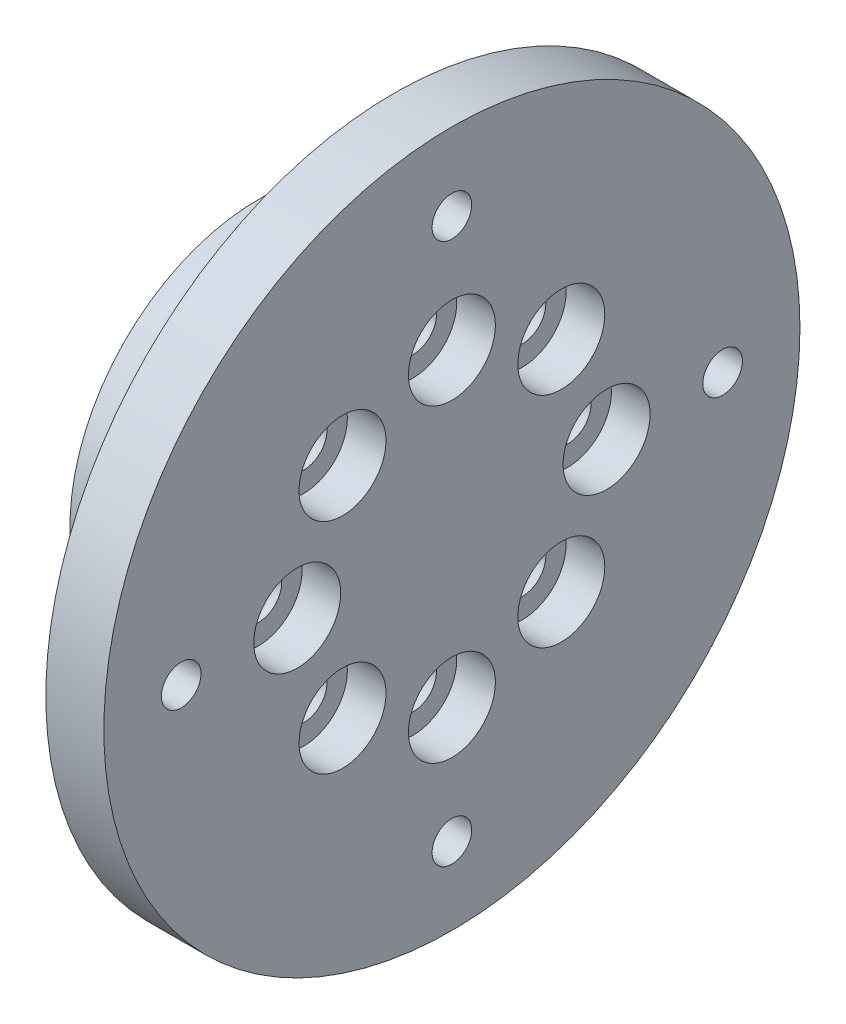
ISO-10303-21;
HEADER;
FILE_DESCRIPTION(('STEP AP214'),'2;1');
FILE_NAME('part.step','',(''),(''),'','','');
FILE_SCHEMA(('AUTOMOTIVE_DESIGN { 1 0 10303 214 1 1 1 1 }'));
ENDSEC;
DATA;
#1=APPLICATION_CONTEXT('core data for automotive mechanical design processes');
#2=APPLICATION_PROTOCOL_DEFINITION('international standard','automotive_design',2000,#1);
#3=PRODUCT_CONTEXT('',#1,'mechanical');
#4=PRODUCT('Part','Part','',(#3));
#5=PRODUCT_RELATED_PRODUCT_CATEGORY('part','',(#4));
#6=PRODUCT_DEFINITION_FORMATION('','',#4);
#7=PRODUCT_DEFINITION_CONTEXT('part definition',#1,'design');
#8=PRODUCT_DEFINITION('design','',#6,#7);
#9=PRODUCT_DEFINITION_SHAPE('','',#8);
#10=(LENGTH_UNIT() NAMED_UNIT(*) SI_UNIT(.MILLI.,.METRE.));
#11=(NAMED_UNIT(*) PLANE_ANGLE_UNIT() SI_UNIT($,.RADIAN.));
#12=(NAMED_UNIT(*) SI_UNIT($,.STERADIAN.) SOLID_ANGLE_UNIT());
#13=UNCERTAINTY_MEASURE_WITH_UNIT(LENGTH_MEASURE(1.E-05),#10,'distance_accuracy_value','');
#14=(GEOMETRIC_REPRESENTATION_CONTEXT(3) GLOBAL_UNCERTAINTY_ASSIGNED_CONTEXT((#13)) GLOBAL_UNIT_ASSIGNED_CONTEXT((#10,
#11,#12)) REPRESENTATION_CONTEXT('',''));
#15=CARTESIAN_POINT('',(0.,0.,0.));
#16=DIRECTION('',(0.,0.,1.));
#17=DIRECTION('',(1.,0.,0.));
#18=AXIS2_PLACEMENT_3D('',#15,#16,#17);
#19=CARTESIAN_POINT('',(10.,0.,0.));
#20=DIRECTION('',(-1.,0.,0.));
#21=DIRECTION('',(0.,0.,1.));
#22=AXIS2_PLACEMENT_3D('',#19,#20,#21);
#23=CYLINDRICAL_SURFACE('',#22,9.75);
#24=CARTESIAN_POINT('',(0.,0.,0.));
#25=DIRECTION('',(1.,0.,0.));
#26=DIRECTION('',(0.,0.,-1.));
#27=AXIS2_PLACEMENT_3D('',#24,#25,#26);
#28=CIRCLE('',#27,9.75);
#29=CARTESIAN_POINT('',(0.,0.,-9.75));
#30=VERTEX_POINT('',#29);
#31=EDGE_CURVE('E48',#30,#30,#28,.T.);
#32=ORIENTED_EDGE('',*,*,#31,.T.);
#33=EDGE_LOOP('',(#32));
#34=FACE_BOUND('',#33,.T.);
#35=CARTESIAN_POINT('',(7.,0.,0.));
#36=DIRECTION('',(1.,0.,0.));
#37=DIRECTION('',(0.,0.,-1.));
#38=AXIS2_PLACEMENT_3D('',#35,#36,#37);
#39=CIRCLE('',#38,9.75);
#40=CARTESIAN_POINT('',(7.,0.,-9.75));
#41=VERTEX_POINT('',#40);
#42=EDGE_CURVE('E10',#41,#41,#39,.T.);
#43=ORIENTED_EDGE('',*,*,#42,.F.);
#44=EDGE_LOOP('',(#43));
#45=FACE_BOUND('',#44,.T.);
#46=ADVANCED_FACE('F41',(#34,#45),#23,.T.);
#47=CARTESIAN_POINT('',(0.,0.,0.));
#48=DIRECTION('',(1.,0.,0.));
#49=DIRECTION('',(0.,0.,-1.));
#50=AXIS2_PLACEMENT_3D('',#47,#48,#49);
#51=PLANE('',#50);
#52=CARTESIAN_POINT('',(0.,0.,0.));
#53=DIRECTION('',(-1.,0.,0.));
#54=DIRECTION('',(0.,0.,1.));
#55=AXIS2_PLACEMENT_3D('',#52,#53,#54);
#56=CIRCLE('',#55,4.);
#57=CARTESIAN_POINT('',(0.,0.,4.));
#58=VERTEX_POINT('',#57);
#59=EDGE_CURVE('E193',#58,#58,#56,.T.);
#60=ORIENTED_EDGE('',*,*,#59,.F.);
#61=EDGE_LOOP('',(#60));
#62=FACE_BOUND('',#61,.T.);
#63=CARTESIAN_POINT('',(0.,8.,0.));
#64=DIRECTION('',(1.,0.,0.));
#65=DIRECTION('',(0.,0.,-1.));
#66=AXIS2_PLACEMENT_3D('',#63,#64,#65);
#67=CIRCLE('',#66,1.2);
#68=CARTESIAN_POINT('',(0.,8.,-1.2));
#69=VERTEX_POINT('',#68);
#70=EDGE_CURVE('E176',#69,#69,#67,.T.);
#71=ORIENTED_EDGE('',*,*,#70,.T.);
#72=EDGE_LOOP('',(#71));
#73=FACE_BOUND('',#72,.T.);
#74=CARTESIAN_POINT('',(0.,5.65685424949262,-5.65685424949248));
#75=DIRECTION('',(1.,0.,0.));
#76=DIRECTION('',(0.,0.,-1.));
#77=AXIS2_PLACEMENT_3D('',#74,#75,#76);
#78=CIRCLE('',#77,1.2);
#79=CARTESIAN_POINT('',(0.,5.65685424949262,-6.85685424949248));
#80=VERTEX_POINT('',#79);
#81=EDGE_CURVE('E160',#80,#80,#78,.T.);
#82=ORIENTED_EDGE('',*,*,#81,.T.);
#83=EDGE_LOOP('',(#82));
#84=FACE_BOUND('',#83,.T.);
#85=CARTESIAN_POINT('',(0.,3.4008079572553E-13,-8.00000000000034));
#86=DIRECTION('',(1.,0.,0.));
#87=DIRECTION('',(0.,0.,-1.));
#88=AXIS2_PLACEMENT_3D('',#85,#86,#87);
#89=CIRCLE('',#88,1.2);
#90=CARTESIAN_POINT('',(0.,3.4008079572553E-13,-9.20000000000034));
#91=VERTEX_POINT('',#90);
#92=EDGE_CURVE('E144',#91,#91,#89,.T.);
#93=ORIENTED_EDGE('',*,*,#92,.T.);
#94=EDGE_LOOP('',(#93));
#95=FACE_BOUND('',#94,.T.);
#96=CARTESIAN_POINT('',(0.,-5.65685424949214,-5.65685424949296));
#97=DIRECTION('',(1.,0.,0.));
#98=DIRECTION('',(0.,0.,-1.));
#99=AXIS2_PLACEMENT_3D('',#96,#97,#98);
#100=CIRCLE('',#99,1.2);
#101=CARTESIAN_POINT('',(0.,-5.65685424949214,-6.85685424949296));
#102=VERTEX_POINT('',#101);
#103=EDGE_CURVE('E128',#102,#102,#100,.T.);
#104=ORIENTED_EDGE('',*,*,#103,.T.);
#105=EDGE_LOOP('',(#104));
#106=FACE_BOUND('',#105,.T.);
#107=CARTESIAN_POINT('',(0.,-8.,-6.8016159145106E-13));
#108=DIRECTION('',(1.,0.,0.));
#109=DIRECTION('',(0.,0.,-1.));
#110=AXIS2_PLACEMENT_3D('',#107,#108,#109);
#111=CIRCLE('',#110,1.2);
#112=CARTESIAN_POINT('',(0.,-8.,-1.20000000000068));
#113=VERTEX_POINT('',#112);
#114=EDGE_CURVE('E112',#113,#113,#111,.T.);
#115=ORIENTED_EDGE('',*,*,#114,.T.);
#116=EDGE_LOOP('',(#115));
#117=FACE_BOUND('',#116,.T.);
#118=CARTESIAN_POINT('',(0.,-5.65685424949262,5.6568542494918));
#119=DIRECTION('',(1.,0.,0.));
#120=DIRECTION('',(0.,0.,-1.));
#121=AXIS2_PLACEMENT_3D('',#118,#119,#120);
#122=CIRCLE('',#121,1.2);
#123=CARTESIAN_POINT('',(0.,-5.65685424949262,4.4568542494918));
#124=VERTEX_POINT('',#123);
#125=EDGE_CURVE('E96',#124,#124,#122,.T.);
#126=ORIENTED_EDGE('',*,*,#125,.T.);
#127=EDGE_LOOP('',(#126));
#128=FACE_BOUND('',#127,.T.);
#129=CARTESIAN_POINT('',(0.,-3.41060513164848E-13,7.99999999999966));
#130=DIRECTION('',(1.,0.,0.));
#131=DIRECTION('',(0.,0.,-1.));
#132=AXIS2_PLACEMENT_3D('',#129,#130,#131);
#133=CIRCLE('',#132,1.2);
#134=CARTESIAN_POINT('',(0.,-3.41060513164848E-13,6.79999999999966));
#135=VERTEX_POINT('',#134);
#136=EDGE_CURVE('E80',#135,#135,#133,.T.);
#137=ORIENTED_EDGE('',*,*,#136,.T.);
#138=EDGE_LOOP('',(#137));
#139=FACE_BOUND('',#138,.T.);
#140=CARTESIAN_POINT('',(0.,5.65685424949214,5.65685424949228));
#141=DIRECTION('',(1.,0.,0.));
#142=DIRECTION('',(0.,0.,-1.));
#143=AXIS2_PLACEMENT_3D('',#140,#141,#142);
#144=CIRCLE('',#143,1.2);
#145=CARTESIAN_POINT('',(0.,5.65685424949214,4.45685424949228));
#146=VERTEX_POINT('',#145);
#147=EDGE_CURVE('E63',#146,#146,#144,.T.);
#148=ORIENTED_EDGE('',*,*,#147,.T.);
#149=EDGE_LOOP('',(#148));
#150=FACE_BOUND('',#149,.T.);
#151=ORIENTED_EDGE('',*,*,#31,.F.);
#152=EDGE_LOOP('',(#151));
#153=FACE_BOUND('',#152,.T.);
#154=ADVANCED_FACE('F253',(#62,#73,#84,#95,#106,#117,#128,#139,#150,#153),#51,.F.);
#155=CARTESIAN_POINT('',(10.,0.,0.));
#156=DIRECTION('',(-1.,0.,0.));
#157=DIRECTION('',(0.,0.,1.));
#158=AXIS2_PLACEMENT_3D('',#155,#156,#157);
#159=CYLINDRICAL_SURFACE('',#158,18.);
#160=CARTESIAN_POINT('',(10.,0.,0.));
#161=DIRECTION('',(1.,0.,0.));
#162=DIRECTION('',(0.,0.,-1.));
#163=AXIS2_PLACEMENT_3D('',#160,#161,#162);
#164=CIRCLE('',#163,18.);
#165=CARTESIAN_POINT('',(10.,0.,-18.));
#166=VERTEX_POINT('',#165);
#167=EDGE_CURVE('E53',#166,#166,#164,.T.);
#168=ORIENTED_EDGE('',*,*,#167,.F.);
#169=EDGE_LOOP('',(#168));
#170=FACE_BOUND('',#169,.T.);
#171=CARTESIAN_POINT('',(7.,0.,0.));
#172=DIRECTION('',(1.,0.,0.));
#173=DIRECTION('',(0.,0.,-1.));
#174=AXIS2_PLACEMENT_3D('',#171,#172,#173);
#175=CIRCLE('',#174,18.);
#176=CARTESIAN_POINT('',(7.,0.,-18.));
#177=VERTEX_POINT('',#176);
#178=EDGE_CURVE('E58',#177,#177,#175,.T.);
#179=ORIENTED_EDGE('',*,*,#178,.T.);
#180=EDGE_LOOP('',(#179));
#181=FACE_BOUND('',#180,.T.);
#182=ADVANCED_FACE('F257',(#170,#181),#159,.T.);
#183=CARTESIAN_POINT('',(7.,0.,0.));
#184=DIRECTION('',(1.,0.,0.));
#185=DIRECTION('',(0.,0.,-1.));
#186=AXIS2_PLACEMENT_3D('',#183,#184,#185);
#187=PLANE('',#186);
#188=CARTESIAN_POINT('',(7.,14.,0.));
#189=DIRECTION('',(1.,0.,0.));
#190=DIRECTION('',(0.,0.,-1.));
#191=AXIS2_PLACEMENT_3D('',#188,#189,#190);
#192=CIRCLE('',#191,1.025);
#193=CARTESIAN_POINT('',(7.,14.,-1.025));
#194=VERTEX_POINT('',#193);
#195=EDGE_CURVE('E224',#194,#194,#192,.T.);
#196=ORIENTED_EDGE('',*,*,#195,.T.);
#197=EDGE_LOOP('',(#196));
#198=FACE_BOUND('',#197,.T.);
#199=CARTESIAN_POINT('',(7.,0.,-14.));
#200=DIRECTION('',(1.,0.,0.));
#201=DIRECTION('',(0.,0.,-1.));
#202=AXIS2_PLACEMENT_3D('',#199,#200,#201);
#203=CIRCLE('',#202,1.025);
#204=CARTESIAN_POINT('',(7.,0.,-15.025));
#205=VERTEX_POINT('',#204);
#206=EDGE_CURVE('E216',#205,#205,#203,.T.);
#207=ORIENTED_EDGE('',*,*,#206,.T.);
#208=EDGE_LOOP('',(#207));
#209=FACE_BOUND('',#208,.T.);
#210=CARTESIAN_POINT('',(7.,-14.,0.));
#211=DIRECTION('',(1.,0.,0.));
#212=DIRECTION('',(0.,0.,-1.));
#213=AXIS2_PLACEMENT_3D('',#210,#211,#212);
#214=CIRCLE('',#213,1.025);
#215=CARTESIAN_POINT('',(7.,-14.,-1.025));
#216=VERTEX_POINT('',#215);
#217=EDGE_CURVE('E208',#216,#216,#214,.T.);
#218=ORIENTED_EDGE('',*,*,#217,.T.);
#219=EDGE_LOOP('',(#218));
#220=FACE_BOUND('',#219,.T.);
#221=CARTESIAN_POINT('',(7.,0.,14.));
#222=DIRECTION('',(1.,0.,0.));
#223=DIRECTION('',(0.,0.,-1.));
#224=AXIS2_PLACEMENT_3D('',#221,#222,#223);
#225=CIRCLE('',#224,1.025);
#226=CARTESIAN_POINT('',(7.,0.,12.975));
#227=VERTEX_POINT('',#226);
#228=EDGE_CURVE('E197',#227,#227,#225,.T.);
#229=ORIENTED_EDGE('',*,*,#228,.T.);
#230=EDGE_LOOP('',(#229));
#231=FACE_BOUND('',#230,.T.);
#232=ORIENTED_EDGE('',*,*,#42,.T.);
#233=EDGE_LOOP('',(#232));
#234=FACE_BOUND('',#233,.T.);
#235=ORIENTED_EDGE('',*,*,#178,.F.);
#236=EDGE_LOOP('',(#235));
#237=FACE_BOUND('',#236,.T.);
#238=ADVANCED_FACE('F263',(#198,#209,#220,#231,#234,#237),#187,.F.);
#239=CARTESIAN_POINT('',(10.,0.,0.));
#240=DIRECTION('',(1.,0.,0.));
#241=DIRECTION('',(0.,0.,-1.));
#242=AXIS2_PLACEMENT_3D('',#239,#240,#241);
#243=PLANE('',#242);
#244=CARTESIAN_POINT('',(10.,14.,0.));
#245=DIRECTION('',(1.,0.,0.));
#246=DIRECTION('',(0.,0.,-1.));
#247=AXIS2_PLACEMENT_3D('',#244,#245,#246);
#248=CIRCLE('',#247,1.025);
#249=CARTESIAN_POINT('',(10.,14.,-1.025));
#250=VERTEX_POINT('',#249);
#251=EDGE_CURVE('E228',#250,#250,#248,.T.);
#252=ORIENTED_EDGE('',*,*,#251,.F.);
#253=EDGE_LOOP('',(#252));
#254=FACE_BOUND('',#253,.T.);
#255=CARTESIAN_POINT('',(10.,0.,-14.));
#256=DIRECTION('',(1.,0.,0.));
#257=DIRECTION('',(0.,0.,-1.));
#258=AXIS2_PLACEMENT_3D('',#255,#256,#257);
#259=CIRCLE('',#258,1.025);
#260=CARTESIAN_POINT('',(10.,0.,-15.025));
#261=VERTEX_POINT('',#260);
#262=EDGE_CURVE('E220',#261,#261,#259,.T.);
#263=ORIENTED_EDGE('',*,*,#262,.F.);
#264=EDGE_LOOP('',(#263));
#265=FACE_BOUND('',#264,.T.);
#266=CARTESIAN_POINT('',(10.,-14.,0.));
#267=DIRECTION('',(1.,0.,0.));
#268=DIRECTION('',(0.,0.,-1.));
#269=AXIS2_PLACEMENT_3D('',#266,#267,#268);
#270=CIRCLE('',#269,1.025);
#271=CARTESIAN_POINT('',(10.,-14.,-1.025));
#272=VERTEX_POINT('',#271);
#273=EDGE_CURVE('E212',#272,#272,#270,.T.);
#274=ORIENTED_EDGE('',*,*,#273,.F.);
#275=EDGE_LOOP('',(#274));
#276=FACE_BOUND('',#275,.T.);
#277=CARTESIAN_POINT('',(10.,0.,14.));
#278=DIRECTION('',(1.,0.,0.));
#279=DIRECTION('',(0.,0.,-1.));
#280=AXIS2_PLACEMENT_3D('',#277,#278,#279);
#281=CIRCLE('',#280,1.025);
#282=CARTESIAN_POINT('',(10.,0.,12.975));
#283=VERTEX_POINT('',#282);
#284=EDGE_CURVE('E204',#283,#283,#281,.T.);
#285=ORIENTED_EDGE('',*,*,#284,.F.);
#286=EDGE_LOOP('',(#285));
#287=FACE_BOUND('',#286,.T.);
#288=CARTESIAN_POINT('',(10.,8.,0.));
#289=DIRECTION('',(1.,0.,0.));
#290=DIRECTION('',(0.,0.,-1.));
#291=AXIS2_PLACEMENT_3D('',#288,#289,#290);
#292=CIRCLE('',#291,2.25);
#293=CARTESIAN_POINT('',(10.,8.,-2.25));
#294=VERTEX_POINT('',#293);
#295=EDGE_CURVE('E188',#294,#294,#292,.T.);
#296=ORIENTED_EDGE('',*,*,#295,.F.);
#297=EDGE_LOOP('',(#296));
#298=FACE_BOUND('',#297,.T.);
#299=CARTESIAN_POINT('',(10.,5.65685424949262,-5.65685424949248));
#300=DIRECTION('',(1.,0.,0.));
#301=DIRECTION('',(0.,0.,-1.));
#302=AXIS2_PLACEMENT_3D('',#299,#300,#301);
#303=CIRCLE('',#302,2.24999999999999);
#304=CARTESIAN_POINT('',(10.,5.65685424949262,-7.90685424949247));
#305=VERTEX_POINT('',#304);
#306=EDGE_CURVE('E172',#305,#305,#303,.T.);
#307=ORIENTED_EDGE('',*,*,#306,.F.);
#308=EDGE_LOOP('',(#307));
#309=FACE_BOUND('',#308,.T.);
#310=CARTESIAN_POINT('',(10.,3.4008079572553E-13,-8.00000000000034));
#311=DIRECTION('',(1.,0.,0.));
#312=DIRECTION('',(0.,0.,-1.));
#313=AXIS2_PLACEMENT_3D('',#310,#311,#312);
#314=CIRCLE('',#313,2.25);
#315=CARTESIAN_POINT('',(10.,3.4008079572553E-13,-10.2500000000003));
#316=VERTEX_POINT('',#315);
#317=EDGE_CURVE('E156',#316,#316,#314,.T.);
#318=ORIENTED_EDGE('',*,*,#317,.F.);
#319=EDGE_LOOP('',(#318));
#320=FACE_BOUND('',#319,.T.);
#321=CARTESIAN_POINT('',(10.,-5.65685424949214,-5.65685424949296));
#322=DIRECTION('',(1.,0.,0.));
#323=DIRECTION('',(0.,0.,-1.));
#324=AXIS2_PLACEMENT_3D('',#321,#322,#323);
#325=CIRCLE('',#324,2.25);
#326=CARTESIAN_POINT('',(10.,-5.65685424949214,-7.90685424949296));
#327=VERTEX_POINT('',#326);
#328=EDGE_CURVE('E140',#327,#327,#325,.T.);
#329=ORIENTED_EDGE('',*,*,#328,.F.);
#330=EDGE_LOOP('',(#329));
#331=FACE_BOUND('',#330,.T.);
#332=CARTESIAN_POINT('',(10.,-8.,-6.8016159145106E-13));
#333=DIRECTION('',(1.,0.,0.));
#334=DIRECTION('',(0.,0.,-1.));
#335=AXIS2_PLACEMENT_3D('',#332,#333,#334);
#336=CIRCLE('',#335,2.25);
#337=CARTESIAN_POINT('',(10.,-8.,-2.25000000000068));
#338=VERTEX_POINT('',#337);
#339=EDGE_CURVE('E124',#338,#338,#336,.T.);
#340=ORIENTED_EDGE('',*,*,#339,.F.);
#341=EDGE_LOOP('',(#340));
#342=FACE_BOUND('',#341,.T.);
#343=CARTESIAN_POINT('',(10.,-5.65685424949262,5.6568542494918));
#344=DIRECTION('',(1.,0.,0.));
#345=DIRECTION('',(0.,0.,-1.));
#346=AXIS2_PLACEMENT_3D('',#343,#344,#345);
#347=CIRCLE('',#346,2.25);
#348=CARTESIAN_POINT('',(10.,-5.65685424949262,3.40685424949181));
#349=VERTEX_POINT('',#348);
#350=EDGE_CURVE('E108',#349,#349,#347,.T.);
#351=ORIENTED_EDGE('',*,*,#350,.F.);
#352=EDGE_LOOP('',(#351));
#353=FACE_BOUND('',#352,.T.);
#354=CARTESIAN_POINT('',(10.,-3.41060513164848E-13,7.99999999999966));
#355=DIRECTION('',(1.,0.,0.));
#356=DIRECTION('',(0.,0.,-1.));
#357=AXIS2_PLACEMENT_3D('',#354,#355,#356);
#358=CIRCLE('',#357,2.25);
#359=CARTESIAN_POINT('',(10.,-3.41060513164848E-13,5.74999999999967));
#360=VERTEX_POINT('',#359);
#361=EDGE_CURVE('E92',#360,#360,#358,.T.);
#362=ORIENTED_EDGE('',*,*,#361,.F.);
#363=EDGE_LOOP('',(#362));
#364=FACE_BOUND('',#363,.T.);
#365=CARTESIAN_POINT('',(10.,5.65685424949214,5.65685424949228));
#366=DIRECTION('',(1.,0.,0.));
#367=DIRECTION('',(0.,0.,-1.));
#368=AXIS2_PLACEMENT_3D('',#365,#366,#367);
#369=CIRCLE('',#368,2.25);
#370=CARTESIAN_POINT('',(10.,5.65685424949214,3.40685424949229));
#371=VERTEX_POINT('',#370);
#372=EDGE_CURVE('E76',#371,#371,#369,.T.);
#373=ORIENTED_EDGE('',*,*,#372,.F.);
#374=EDGE_LOOP('',(#373));
#375=FACE_BOUND('',#374,.T.);
#376=ORIENTED_EDGE('',*,*,#167,.T.);
#377=EDGE_LOOP('',(#376));
#378=FACE_BOUND('',#377,.T.);
#379=ADVANCED_FACE('F269',(#254,#265,#276,#287,#298,#309,#320,#331,#342,#353,#364,#375,#378),
#243,.T.);
#380=CARTESIAN_POINT('',(10.,5.65685424949214,5.65685424949228));
#381=DIRECTION('',(1.,0.,0.));
#382=DIRECTION('',(0.,0.,-1.));
#383=AXIS2_PLACEMENT_3D('',#380,#381,#382);
#384=CYLINDRICAL_SURFACE('',#383,1.2);
#385=ORIENTED_EDGE('',*,*,#147,.F.);
#386=EDGE_LOOP('',(#385));
#387=FACE_BOUND('',#386,.T.);
#388=CARTESIAN_POINT('',(8.,5.65685424949214,5.65685424949228));
#389=DIRECTION('',(1.,0.,0.));
#390=DIRECTION('',(0.,0.,-1.));
#391=AXIS2_PLACEMENT_3D('',#388,#389,#390);
#392=CIRCLE('',#391,1.20000000000001);
#393=CARTESIAN_POINT('',(8.,5.65685424949214,4.45685424949227));
#394=VERTEX_POINT('',#393);
#395=EDGE_CURVE('E68',#394,#394,#392,.T.);
#396=ORIENTED_EDGE('',*,*,#395,.T.);
#397=EDGE_LOOP('',(#396));
#398=FACE_BOUND('',#397,.T.);
#399=ADVANCED_FACE('F271',(#387,#398),#384,.F.);
#400=CARTESIAN_POINT('',(8.,6.85685424949215,5.65685424949228));
#401=DIRECTION('',(-1.,0.,0.));
#402=DIRECTION('',(0.,0.,1.));
#403=AXIS2_PLACEMENT_3D('',#400,#401,#402);
#404=PLANE('',#403);
#405=ORIENTED_EDGE('',*,*,#395,.F.);
#406=EDGE_LOOP('',(#405));
#407=FACE_BOUND('',#406,.T.);
#408=CARTESIAN_POINT('',(8.,5.65685424949214,5.65685424949228));
#409=DIRECTION('',(1.,0.,0.));
#410=DIRECTION('',(0.,0.,-1.));
#411=AXIS2_PLACEMENT_3D('',#408,#409,#410);
#412=CIRCLE('',#411,2.25);
#413=CARTESIAN_POINT('',(8.,5.65685424949214,3.40685424949229));
#414=VERTEX_POINT('',#413);
#415=EDGE_CURVE('E72',#414,#414,#412,.T.);
#416=ORIENTED_EDGE('',*,*,#415,.T.);
#417=EDGE_LOOP('',(#416));
#418=FACE_BOUND('',#417,.T.);
#419=ADVANCED_FACE('F279',(#407,#418),#404,.F.);
#420=CARTESIAN_POINT('',(10.,5.65685424949214,5.65685424949228));
#421=DIRECTION('',(1.,0.,0.));
#422=DIRECTION('',(0.,0.,-1.));
#423=AXIS2_PLACEMENT_3D('',#420,#421,#422);
#424=CYLINDRICAL_SURFACE('',#423,2.25);
#425=ORIENTED_EDGE('',*,*,#415,.F.);
#426=EDGE_LOOP('',(#425));
#427=FACE_BOUND('',#426,.T.);
#428=ORIENTED_EDGE('',*,*,#372,.T.);
#429=EDGE_LOOP('',(#428));
#430=FACE_BOUND('',#429,.T.);
#431=ADVANCED_FACE('F283',(#427,#430),#424,.F.);
#432=CARTESIAN_POINT('',(10.,-3.41060513164848E-13,7.99999999999966));
#433=DIRECTION('',(1.,0.,0.));
#434=DIRECTION('',(0.,0.,-1.));
#435=AXIS2_PLACEMENT_3D('',#432,#433,#434);
#436=CYLINDRICAL_SURFACE('',#435,1.2);
#437=ORIENTED_EDGE('',*,*,#136,.F.);
#438=EDGE_LOOP('',(#437));
#439=FACE_BOUND('',#438,.T.);
#440=CARTESIAN_POINT('',(8.,-3.41060513164848E-13,7.99999999999966));
#441=DIRECTION('',(1.,0.,0.));
#442=DIRECTION('',(0.,0.,-1.));
#443=AXIS2_PLACEMENT_3D('',#440,#441,#442);
#444=CIRCLE('',#443,1.20000000000001);
#445=CARTESIAN_POINT('',(8.,-3.41060513164848E-13,6.79999999999965));
#446=VERTEX_POINT('',#445);
#447=EDGE_CURVE('E84',#446,#446,#444,.T.);
#448=ORIENTED_EDGE('',*,*,#447,.T.);
#449=EDGE_LOOP('',(#448));
#450=FACE_BOUND('',#449,.T.);
#451=ADVANCED_FACE('F287',(#439,#450),#436,.F.);
#452=CARTESIAN_POINT('',(8.,1.19999999999967,7.99999999999966));
#453=DIRECTION('',(-1.,0.,0.));
#454=DIRECTION('',(0.,0.,1.));
#455=AXIS2_PLACEMENT_3D('',#452,#453,#454);
#456=PLANE('',#455);
#457=ORIENTED_EDGE('',*,*,#447,.F.);
#458=EDGE_LOOP('',(#457));
#459=FACE_BOUND('',#458,.T.);
#460=CARTESIAN_POINT('',(8.,-3.41060513164848E-13,7.99999999999966));
#461=DIRECTION('',(1.,0.,0.));
#462=DIRECTION('',(0.,0.,-1.));
#463=AXIS2_PLACEMENT_3D('',#460,#461,#462);
#464=CIRCLE('',#463,2.25);
#465=CARTESIAN_POINT('',(8.,-3.41060513164848E-13,5.74999999999967));
#466=VERTEX_POINT('',#465);
#467=EDGE_CURVE('E88',#466,#466,#464,.T.);
#468=ORIENTED_EDGE('',*,*,#467,.T.);
#469=EDGE_LOOP('',(#468));
#470=FACE_BOUND('',#469,.T.);
#471=ADVANCED_FACE('F291',(#459,#470),#456,.F.);
#472=CARTESIAN_POINT('',(10.,-3.41060513164848E-13,7.99999999999966));
#473=DIRECTION('',(1.,0.,0.));
#474=DIRECTION('',(0.,0.,-1.));
#475=AXIS2_PLACEMENT_3D('',#472,#473,#474);
#476=CYLINDRICAL_SURFACE('',#475,2.25);
#477=ORIENTED_EDGE('',*,*,#467,.F.);
#478=EDGE_LOOP('',(#477));
#479=FACE_BOUND('',#478,.T.);
#480=ORIENTED_EDGE('',*,*,#361,.T.);
#481=EDGE_LOOP('',(#480));
#482=FACE_BOUND('',#481,.T.);
#483=ADVANCED_FACE('F295',(#479,#482),#476,.F.);
#484=CARTESIAN_POINT('',(10.,-5.65685424949262,5.6568542494918));
#485=DIRECTION('',(1.,0.,0.));
#486=DIRECTION('',(0.,0.,-1.));
#487=AXIS2_PLACEMENT_3D('',#484,#485,#486);
#488=CYLINDRICAL_SURFACE('',#487,1.2);
#489=ORIENTED_EDGE('',*,*,#125,.F.);
#490=EDGE_LOOP('',(#489));
#491=FACE_BOUND('',#490,.T.);
#492=CARTESIAN_POINT('',(8.,-5.65685424949262,5.6568542494918));
#493=DIRECTION('',(1.,0.,0.));
#494=DIRECTION('',(0.,0.,-1.));
#495=AXIS2_PLACEMENT_3D('',#492,#493,#494);
#496=CIRCLE('',#495,1.20000000000001);
#497=CARTESIAN_POINT('',(8.,-5.65685424949262,4.45685424949179));
#498=VERTEX_POINT('',#497);
#499=EDGE_CURVE('E100',#498,#498,#496,.T.);
#500=ORIENTED_EDGE('',*,*,#499,.T.);
#501=EDGE_LOOP('',(#500));
#502=FACE_BOUND('',#501,.T.);
#503=ADVANCED_FACE('F299',(#491,#502),#488,.F.);
#504=CARTESIAN_POINT('',(8.,-4.45685424949261,5.6568542494918));
#505=DIRECTION('',(-1.,0.,0.));
#506=DIRECTION('',(0.,0.,1.));
#507=AXIS2_PLACEMENT_3D('',#504,#505,#506);
#508=PLANE('',#507);
#509=ORIENTED_EDGE('',*,*,#499,.F.);
#510=EDGE_LOOP('',(#509));
#511=FACE_BOUND('',#510,.T.);
#512=CARTESIAN_POINT('',(8.,-5.65685424949262,5.6568542494918));
#513=DIRECTION('',(1.,0.,0.));
#514=DIRECTION('',(0.,0.,-1.));
#515=AXIS2_PLACEMENT_3D('',#512,#513,#514);
#516=CIRCLE('',#515,2.25);
#517=CARTESIAN_POINT('',(8.,-5.65685424949262,3.40685424949181));
#518=VERTEX_POINT('',#517);
#519=EDGE_CURVE('E104',#518,#518,#516,.T.);
#520=ORIENTED_EDGE('',*,*,#519,.T.);
#521=EDGE_LOOP('',(#520));
#522=FACE_BOUND('',#521,.T.);
#523=ADVANCED_FACE('F303',(#511,#522),#508,.F.);
#524=CARTESIAN_POINT('',(10.,-5.65685424949262,5.6568542494918));
#525=DIRECTION('',(1.,0.,0.));
#526=DIRECTION('',(0.,0.,-1.));
#527=AXIS2_PLACEMENT_3D('',#524,#525,#526);
#528=CYLINDRICAL_SURFACE('',#527,2.25);
#529=ORIENTED_EDGE('',*,*,#519,.F.);
#530=EDGE_LOOP('',(#529));
#531=FACE_BOUND('',#530,.T.);
#532=ORIENTED_EDGE('',*,*,#350,.T.);
#533=EDGE_LOOP('',(#532));
#534=FACE_BOUND('',#533,.T.);
#535=ADVANCED_FACE('F307',(#531,#534),#528,.F.);
#536=CARTESIAN_POINT('',(10.,-8.,-6.8016159145106E-13));
#537=DIRECTION('',(1.,0.,0.));
#538=DIRECTION('',(0.,0.,-1.));
#539=AXIS2_PLACEMENT_3D('',#536,#537,#538);
#540=CYLINDRICAL_SURFACE('',#539,1.2);
#541=ORIENTED_EDGE('',*,*,#114,.F.);
#542=EDGE_LOOP('',(#541));
#543=FACE_BOUND('',#542,.T.);
#544=CARTESIAN_POINT('',(8.,-8.,-6.8016159145106E-13));
#545=DIRECTION('',(1.,0.,0.));
#546=DIRECTION('',(0.,0.,-1.));
#547=AXIS2_PLACEMENT_3D('',#544,#545,#546);
#548=CIRCLE('',#547,1.20000000000001);
#549=CARTESIAN_POINT('',(8.,-8.,-1.20000000000069));
#550=VERTEX_POINT('',#549);
#551=EDGE_CURVE('E116',#550,#550,#548,.T.);
#552=ORIENTED_EDGE('',*,*,#551,.T.);
#553=EDGE_LOOP('',(#552));
#554=FACE_BOUND('',#553,.T.);
#555=ADVANCED_FACE('F311',(#543,#554),#540,.F.);
#556=CARTESIAN_POINT('',(8.,-6.79999999999999,-6.8016159145106E-13));
#557=DIRECTION('',(-1.,0.,0.));
#558=DIRECTION('',(0.,0.,1.));
#559=AXIS2_PLACEMENT_3D('',#556,#557,#558);
#560=PLANE('',#559);
#561=ORIENTED_EDGE('',*,*,#551,.F.);
#562=EDGE_LOOP('',(#561));
#563=FACE_BOUND('',#562,.T.);
#564=CARTESIAN_POINT('',(8.,-8.,-6.8016159145106E-13));
#565=DIRECTION('',(1.,0.,0.));
#566=DIRECTION('',(0.,0.,-1.));
#567=AXIS2_PLACEMENT_3D('',#564,#565,#566);
#568=CIRCLE('',#567,2.25);
#569=CARTESIAN_POINT('',(8.,-8.,-2.25000000000068));
#570=VERTEX_POINT('',#569);
#571=EDGE_CURVE('E120',#570,#570,#568,.T.);
#572=ORIENTED_EDGE('',*,*,#571,.T.);
#573=EDGE_LOOP('',(#572));
#574=FACE_BOUND('',#573,.T.);
#575=ADVANCED_FACE('F315',(#563,#574),#560,.F.);
#576=CARTESIAN_POINT('',(10.,-8.,-6.8016159145106E-13));
#577=DIRECTION('',(1.,0.,0.));
#578=DIRECTION('',(0.,0.,-1.));
#579=AXIS2_PLACEMENT_3D('',#576,#577,#578);
#580=CYLINDRICAL_SURFACE('',#579,2.25);
#581=ORIENTED_EDGE('',*,*,#571,.F.);
#582=EDGE_LOOP('',(#581));
#583=FACE_BOUND('',#582,.T.);
#584=ORIENTED_EDGE('',*,*,#339,.T.);
#585=EDGE_LOOP('',(#584));
#586=FACE_BOUND('',#585,.T.);
#587=ADVANCED_FACE('F319',(#583,#586),#580,.F.);
#588=CARTESIAN_POINT('',(10.,-5.65685424949214,-5.65685424949296));
#589=DIRECTION('',(1.,0.,0.));
#590=DIRECTION('',(0.,0.,-1.));
#591=AXIS2_PLACEMENT_3D('',#588,#589,#590);
#592=CYLINDRICAL_SURFACE('',#591,1.2);
#593=ORIENTED_EDGE('',*,*,#103,.F.);
#594=EDGE_LOOP('',(#593));
#595=FACE_BOUND('',#594,.T.);
#596=CARTESIAN_POINT('',(8.,-5.65685424949214,-5.65685424949296));
#597=DIRECTION('',(1.,0.,0.));
#598=DIRECTION('',(0.,0.,-1.));
#599=AXIS2_PLACEMENT_3D('',#596,#597,#598);
#600=CIRCLE('',#599,1.20000000000001);
#601=CARTESIAN_POINT('',(8.,-5.65685424949214,-6.85685424949297));
#602=VERTEX_POINT('',#601);
#603=EDGE_CURVE('E132',#602,#602,#600,.T.);
#604=ORIENTED_EDGE('',*,*,#603,.T.);
#605=EDGE_LOOP('',(#604));
#606=FACE_BOUND('',#605,.T.);
#607=ADVANCED_FACE('F323',(#595,#606),#592,.F.);
#608=CARTESIAN_POINT('',(8.,-4.45685424949213,-5.65685424949296));
#609=DIRECTION('',(-1.,0.,0.));
#610=DIRECTION('',(0.,0.,1.));
#611=AXIS2_PLACEMENT_3D('',#608,#609,#610);
#612=PLANE('',#611);
#613=ORIENTED_EDGE('',*,*,#603,.F.);
#614=EDGE_LOOP('',(#613));
#615=FACE_BOUND('',#614,.T.);
#616=CARTESIAN_POINT('',(8.,-5.65685424949214,-5.65685424949296));
#617=DIRECTION('',(1.,0.,0.));
#618=DIRECTION('',(0.,0.,-1.));
#619=AXIS2_PLACEMENT_3D('',#616,#617,#618);
#620=CIRCLE('',#619,2.25);
#621=CARTESIAN_POINT('',(8.,-5.65685424949214,-7.90685424949296));
#622=VERTEX_POINT('',#621);
#623=EDGE_CURVE('E136',#622,#622,#620,.T.);
#624=ORIENTED_EDGE('',*,*,#623,.T.);
#625=EDGE_LOOP('',(#624));
#626=FACE_BOUND('',#625,.T.);
#627=ADVANCED_FACE('F327',(#615,#626),#612,.F.);
#628=CARTESIAN_POINT('',(10.,-5.65685424949214,-5.65685424949296));
#629=DIRECTION('',(1.,0.,0.));
#630=DIRECTION('',(0.,0.,-1.));
#631=AXIS2_PLACEMENT_3D('',#628,#629,#630);
#632=CYLINDRICAL_SURFACE('',#631,2.25);
#633=ORIENTED_EDGE('',*,*,#623,.F.);
#634=EDGE_LOOP('',(#633));
#635=FACE_BOUND('',#634,.T.);
#636=ORIENTED_EDGE('',*,*,#328,.T.);
#637=EDGE_LOOP('',(#636));
#638=FACE_BOUND('',#637,.T.);
#639=ADVANCED_FACE('F331',(#635,#638),#632,.F.);
#640=CARTESIAN_POINT('',(10.,3.4008079572553E-13,-8.00000000000034));
#641=DIRECTION('',(1.,0.,0.));
#642=DIRECTION('',(0.,0.,-1.));
#643=AXIS2_PLACEMENT_3D('',#640,#641,#642);
#644=CYLINDRICAL_SURFACE('',#643,1.2);
#645=ORIENTED_EDGE('',*,*,#92,.F.);
#646=EDGE_LOOP('',(#645));
#647=FACE_BOUND('',#646,.T.);
#648=CARTESIAN_POINT('',(8.,3.4008079572553E-13,-8.00000000000034));
#649=DIRECTION('',(1.,0.,0.));
#650=DIRECTION('',(0.,0.,-1.));
#651=AXIS2_PLACEMENT_3D('',#648,#649,#650);
#652=CIRCLE('',#651,1.20000000000001);
#653=CARTESIAN_POINT('',(8.,3.4008079572553E-13,-9.20000000000035));
#654=VERTEX_POINT('',#653);
#655=EDGE_CURVE('E148',#654,#654,#652,.T.);
#656=ORIENTED_EDGE('',*,*,#655,.T.);
#657=EDGE_LOOP('',(#656));
#658=FACE_BOUND('',#657,.T.);
#659=ADVANCED_FACE('F335',(#647,#658),#644,.F.);
#660=CARTESIAN_POINT('',(8.,1.20000000000035,-8.00000000000034));
#661=DIRECTION('',(-1.,0.,0.));
#662=DIRECTION('',(0.,0.,1.));
#663=AXIS2_PLACEMENT_3D('',#660,#661,#662);
#664=PLANE('',#663);
#665=ORIENTED_EDGE('',*,*,#655,.F.);
#666=EDGE_LOOP('',(#665));
#667=FACE_BOUND('',#666,.T.);
#668=CARTESIAN_POINT('',(8.,3.4008079572553E-13,-8.00000000000034));
#669=DIRECTION('',(1.,0.,0.));
#670=DIRECTION('',(0.,0.,-1.));
#671=AXIS2_PLACEMENT_3D('',#668,#669,#670);
#672=CIRCLE('',#671,2.25);
#673=CARTESIAN_POINT('',(8.,3.4008079572553E-13,-10.2500000000003));
#674=VERTEX_POINT('',#673);
#675=EDGE_CURVE('E152',#674,#674,#672,.T.);
#676=ORIENTED_EDGE('',*,*,#675,.T.);
#677=EDGE_LOOP('',(#676));
#678=FACE_BOUND('',#677,.T.);
#679=ADVANCED_FACE('F339',(#667,#678),#664,.F.);
#680=CARTESIAN_POINT('',(10.,3.4008079572553E-13,-8.00000000000034));
#681=DIRECTION('',(1.,0.,0.));
#682=DIRECTION('',(0.,0.,-1.));
#683=AXIS2_PLACEMENT_3D('',#680,#681,#682);
#684=CYLINDRICAL_SURFACE('',#683,2.25);
#685=ORIENTED_EDGE('',*,*,#675,.F.);
#686=EDGE_LOOP('',(#685));
#687=FACE_BOUND('',#686,.T.);
#688=ORIENTED_EDGE('',*,*,#317,.T.);
#689=EDGE_LOOP('',(#688));
#690=FACE_BOUND('',#689,.T.);
#691=ADVANCED_FACE('F343',(#687,#690),#684,.F.);
#692=CARTESIAN_POINT('',(10.,5.65685424949262,-5.65685424949248));
#693=DIRECTION('',(1.,0.,0.));
#694=DIRECTION('',(0.,0.,-1.));
#695=AXIS2_PLACEMENT_3D('',#692,#693,#694);
#696=CYLINDRICAL_SURFACE('',#695,1.2);
#697=ORIENTED_EDGE('',*,*,#81,.F.);
#698=EDGE_LOOP('',(#697));
#699=FACE_BOUND('',#698,.T.);
#700=CARTESIAN_POINT('',(8.,5.65685424949262,-5.65685424949248));
#701=DIRECTION('',(1.,0.,0.));
#702=DIRECTION('',(0.,0.,-1.));
#703=AXIS2_PLACEMENT_3D('',#700,#701,#702);
#704=CIRCLE('',#703,1.20000000000001);
#705=CARTESIAN_POINT('',(8.,5.65685424949262,-6.85685424949249));
#706=VERTEX_POINT('',#705);
#707=EDGE_CURVE('E164',#706,#706,#704,.T.);
#708=ORIENTED_EDGE('',*,*,#707,.T.);
#709=EDGE_LOOP('',(#708));
#710=FACE_BOUND('',#709,.T.);
#711=ADVANCED_FACE('F347',(#699,#710),#696,.F.);
#712=CARTESIAN_POINT('',(8.,6.85685424949263,-5.65685424949248));
#713=DIRECTION('',(-1.,0.,0.));
#714=DIRECTION('',(0.,0.,1.));
#715=AXIS2_PLACEMENT_3D('',#712,#713,#714);
#716=PLANE('',#715);
#717=ORIENTED_EDGE('',*,*,#707,.F.);
#718=EDGE_LOOP('',(#717));
#719=FACE_BOUND('',#718,.T.);
#720=CARTESIAN_POINT('',(8.,5.65685424949262,-5.65685424949248));
#721=DIRECTION('',(1.,0.,0.));
#722=DIRECTION('',(0.,0.,-1.));
#723=AXIS2_PLACEMENT_3D('',#720,#721,#722);
#724=CIRCLE('',#723,2.24999999999999);
#725=CARTESIAN_POINT('',(8.,5.65685424949262,-7.90685424949247));
#726=VERTEX_POINT('',#725);
#727=EDGE_CURVE('E168',#726,#726,#724,.T.);
#728=ORIENTED_EDGE('',*,*,#727,.T.);
#729=EDGE_LOOP('',(#728));
#730=FACE_BOUND('',#729,.T.);
#731=ADVANCED_FACE('F351',(#719,#730),#716,.F.);
#732=CARTESIAN_POINT('',(10.,5.65685424949262,-5.65685424949248));
#733=DIRECTION('',(1.,0.,0.));
#734=DIRECTION('',(0.,0.,-1.));
#735=AXIS2_PLACEMENT_3D('',#732,#733,#734);
#736=CYLINDRICAL_SURFACE('',#735,2.24999999999999);
#737=ORIENTED_EDGE('',*,*,#727,.F.);
#738=EDGE_LOOP('',(#737));
#739=FACE_BOUND('',#738,.T.);
#740=ORIENTED_EDGE('',*,*,#306,.T.);
#741=EDGE_LOOP('',(#740));
#742=FACE_BOUND('',#741,.T.);
#743=ADVANCED_FACE('F355',(#739,#742),#736,.F.);
#744=CARTESIAN_POINT('',(10.,8.,0.));
#745=DIRECTION('',(1.,0.,0.));
#746=DIRECTION('',(0.,0.,-1.));
#747=AXIS2_PLACEMENT_3D('',#744,#745,#746);
#748=CYLINDRICAL_SURFACE('',#747,1.2);
#749=ORIENTED_EDGE('',*,*,#70,.F.);
#750=EDGE_LOOP('',(#749));
#751=FACE_BOUND('',#750,.T.);
#752=CARTESIAN_POINT('',(8.,8.,0.));
#753=DIRECTION('',(1.,0.,0.));
#754=DIRECTION('',(0.,0.,-1.));
#755=AXIS2_PLACEMENT_3D('',#752,#753,#754);
#756=CIRCLE('',#755,1.20000000000001);
#757=CARTESIAN_POINT('',(8.,8.,-1.20000000000001));
#758=VERTEX_POINT('',#757);
#759=EDGE_CURVE('E180',#758,#758,#756,.T.);
#760=ORIENTED_EDGE('',*,*,#759,.T.);
#761=EDGE_LOOP('',(#760));
#762=FACE_BOUND('',#761,.T.);
#763=ADVANCED_FACE('F359',(#751,#762),#748,.F.);
#764=CARTESIAN_POINT('',(8.,9.20000000000001,0.));
#765=DIRECTION('',(-1.,0.,0.));
#766=DIRECTION('',(0.,0.,1.));
#767=AXIS2_PLACEMENT_3D('',#764,#765,#766);
#768=PLANE('',#767);
#769=ORIENTED_EDGE('',*,*,#759,.F.);
#770=EDGE_LOOP('',(#769));
#771=FACE_BOUND('',#770,.T.);
#772=CARTESIAN_POINT('',(8.,8.,0.));
#773=DIRECTION('',(1.,0.,0.));
#774=DIRECTION('',(0.,0.,-1.));
#775=AXIS2_PLACEMENT_3D('',#772,#773,#774);
#776=CIRCLE('',#775,2.25);
#777=CARTESIAN_POINT('',(8.,8.,-2.25));
#778=VERTEX_POINT('',#777);
#779=EDGE_CURVE('E184',#778,#778,#776,.T.);
#780=ORIENTED_EDGE('',*,*,#779,.T.);
#781=EDGE_LOOP('',(#780));
#782=FACE_BOUND('',#781,.T.);
#783=ADVANCED_FACE('F363',(#771,#782),#768,.F.);
#784=CARTESIAN_POINT('',(10.,8.,0.));
#785=DIRECTION('',(1.,0.,0.));
#786=DIRECTION('',(0.,0.,-1.));
#787=AXIS2_PLACEMENT_3D('',#784,#785,#786);
#788=CYLINDRICAL_SURFACE('',#787,2.25);
#789=ORIENTED_EDGE('',*,*,#779,.F.);
#790=EDGE_LOOP('',(#789));
#791=FACE_BOUND('',#790,.T.);
#792=ORIENTED_EDGE('',*,*,#295,.T.);
#793=EDGE_LOOP('',(#792));
#794=FACE_BOUND('',#793,.T.);
#795=ADVANCED_FACE('F367',(#791,#794),#788,.F.);
#796=CARTESIAN_POINT('',(2.2,0.,0.));
#797=DIRECTION('',(-1.,0.,0.));
#798=DIRECTION('',(0.,0.,1.));
#799=AXIS2_PLACEMENT_3D('',#796,#797,#798);
#800=CYLINDRICAL_SURFACE('',#799,4.);
#801=CARTESIAN_POINT('',(2.2,0.,0.));
#802=DIRECTION('',(-1.,0.,0.));
#803=DIRECTION('',(0.,0.,1.));
#804=AXIS2_PLACEMENT_3D('',#801,#802,#803);
#805=CIRCLE('',#804,4.);
#806=CARTESIAN_POINT('',(2.2,0.,4.));
#807=VERTEX_POINT('',#806);
#808=EDGE_CURVE('E192',#807,#807,#805,.T.);
#809=ORIENTED_EDGE('',*,*,#808,.F.);
#810=EDGE_LOOP('',(#809));
#811=FACE_BOUND('',#810,.T.);
#812=ORIENTED_EDGE('',*,*,#59,.T.);
#813=EDGE_LOOP('',(#812));
#814=FACE_BOUND('',#813,.T.);
#815=ADVANCED_FACE('F371',(#811,#814),#800,.F.);
#816=CARTESIAN_POINT('',(2.2,0.,0.));
#817=DIRECTION('',(-1.,0.,0.));
#818=DIRECTION('',(0.,0.,1.));
#819=AXIS2_PLACEMENT_3D('',#816,#817,#818);
#820=PLANE('',#819);
#821=CARTESIAN_POINT('',(2.2,0.,0.));
#822=DIRECTION('',(1.,0.,0.));
#823=DIRECTION('',(0.,0.,-1.));
#824=AXIS2_PLACEMENT_3D('',#821,#822,#823);
#825=CIRCLE('',#824,2.5);
#826=CARTESIAN_POINT('',(2.2,0.,-2.5));
#827=VERTEX_POINT('',#826);
#828=EDGE_CURVE('E233',#827,#827,#825,.T.);
#829=ORIENTED_EDGE('',*,*,#828,.T.);
#830=EDGE_LOOP('',(#829));
#831=FACE_BOUND('',#830,.T.);
#832=ORIENTED_EDGE('',*,*,#808,.T.);
#833=EDGE_LOOP('',(#832));
#834=FACE_BOUND('',#833,.T.);
#835=ADVANCED_FACE('F375',(#831,#834),#820,.T.);
#836=CARTESIAN_POINT('',(10.,0.,14.));
#837=DIRECTION('',(1.,0.,0.));
#838=DIRECTION('',(0.,0.,-1.));
#839=AXIS2_PLACEMENT_3D('',#836,#837,#838);
#840=CYLINDRICAL_SURFACE('',#839,1.025);
#841=ORIENTED_EDGE('',*,*,#284,.T.);
#842=EDGE_LOOP('',(#841));
#843=FACE_BOUND('',#842,.T.);
#844=ORIENTED_EDGE('',*,*,#228,.F.);
#845=EDGE_LOOP('',(#844));
#846=FACE_BOUND('',#845,.T.);
#847=ADVANCED_FACE('F379',(#843,#846),#840,.F.);
#848=CARTESIAN_POINT('',(10.,-14.,0.));
#849=DIRECTION('',(1.,0.,0.));
#850=DIRECTION('',(0.,0.,-1.));
#851=AXIS2_PLACEMENT_3D('',#848,#849,#850);
#852=CYLINDRICAL_SURFACE('',#851,1.025);
#853=ORIENTED_EDGE('',*,*,#273,.T.);
#854=EDGE_LOOP('',(#853));
#855=FACE_BOUND('',#854,.T.);
#856=ORIENTED_EDGE('',*,*,#217,.F.);
#857=EDGE_LOOP('',(#856));
#858=FACE_BOUND('',#857,.T.);
#859=ADVANCED_FACE('F383',(#855,#858),#852,.F.);
#860=CARTESIAN_POINT('',(10.,0.,-14.));
#861=DIRECTION('',(1.,0.,0.));
#862=DIRECTION('',(0.,0.,-1.));
#863=AXIS2_PLACEMENT_3D('',#860,#861,#862);
#864=CYLINDRICAL_SURFACE('',#863,1.025);
#865=ORIENTED_EDGE('',*,*,#262,.T.);
#866=EDGE_LOOP('',(#865));
#867=FACE_BOUND('',#866,.T.);
#868=ORIENTED_EDGE('',*,*,#206,.F.);
#869=EDGE_LOOP('',(#868));
#870=FACE_BOUND('',#869,.T.);
#871=ADVANCED_FACE('F387',(#867,#870),#864,.F.);
#872=CARTESIAN_POINT('',(10.,14.,0.));
#873=DIRECTION('',(1.,0.,0.));
#874=DIRECTION('',(0.,0.,-1.));
#875=AXIS2_PLACEMENT_3D('',#872,#873,#874);
#876=CYLINDRICAL_SURFACE('',#875,1.025);
#877=ORIENTED_EDGE('',*,*,#251,.T.);
#878=EDGE_LOOP('',(#877));
#879=FACE_BOUND('',#878,.T.);
#880=ORIENTED_EDGE('',*,*,#195,.F.);
#881=EDGE_LOOP('',(#880));
#882=FACE_BOUND('',#881,.T.);
#883=ADVANCED_FACE('F250',(#879,#882),#876,.F.);
#884=CARTESIAN_POINT('',(5.2,0.,0.));
#885=DIRECTION('',(-1.,0.,0.));
#886=DIRECTION('',(0.,0.,1.));
#887=AXIS2_PLACEMENT_3D('',#884,#885,#886);
#888=CYLINDRICAL_SURFACE('',#887,2.5);
#889=CARTESIAN_POINT('',(5.2,0.,0.));
#890=DIRECTION('',(1.,0.,0.));
#891=DIRECTION('',(0.,0.,-1.));
#892=AXIS2_PLACEMENT_3D('',#889,#890,#891);
#893=CIRCLE('',#892,2.5);
#894=CARTESIAN_POINT('',(5.2,0.,-2.5));
#895=VERTEX_POINT('',#894);
#896=EDGE_CURVE('E232',#895,#895,#893,.T.);
#897=ORIENTED_EDGE('',*,*,#896,.T.);
#898=EDGE_LOOP('',(#897));
#899=FACE_BOUND('',#898,.T.);
#900=ORIENTED_EDGE('',*,*,#828,.F.);
#901=EDGE_LOOP('',(#900));
#902=FACE_BOUND('',#901,.T.);
#903=ADVANCED_FACE('F241',(#899,#902),#888,.F.);
#904=CARTESIAN_POINT('',(5.2,0.,0.));
#905=DIRECTION('',(1.,0.,0.));
#906=DIRECTION('',(0.,0.,-1.));
#907=AXIS2_PLACEMENT_3D('',#904,#905,#906);
#908=PLANE('',#907);
#909=ORIENTED_EDGE('',*,*,#896,.F.);
#910=EDGE_LOOP('',(#909));
#911=FACE_BOUND('',#910,.T.);
#912=ADVANCED_FACE('F244',(#911),#908,.F.);
#913=CLOSED_SHELL('',(#46,#154,#182,#238,#379,#399,#419,#431,#451,#471,#483,#503,#523,#535,#555,
#575,#587,#607,#627,#639,#659,#679,#691,#711,#731,#743,#763,#783,#795,#815,#835,#847,#859,#871,
#883,#903,#912));
#914=MANIFOLD_SOLID_BREP('B2',#913);
#915=ADVANCED_BREP_SHAPE_REPRESENTATION('',(#18,#914),#14);
#916=SHAPE_DEFINITION_REPRESENTATION(#9,#915);
ENDSEC;
END-ISO-10303-21;
